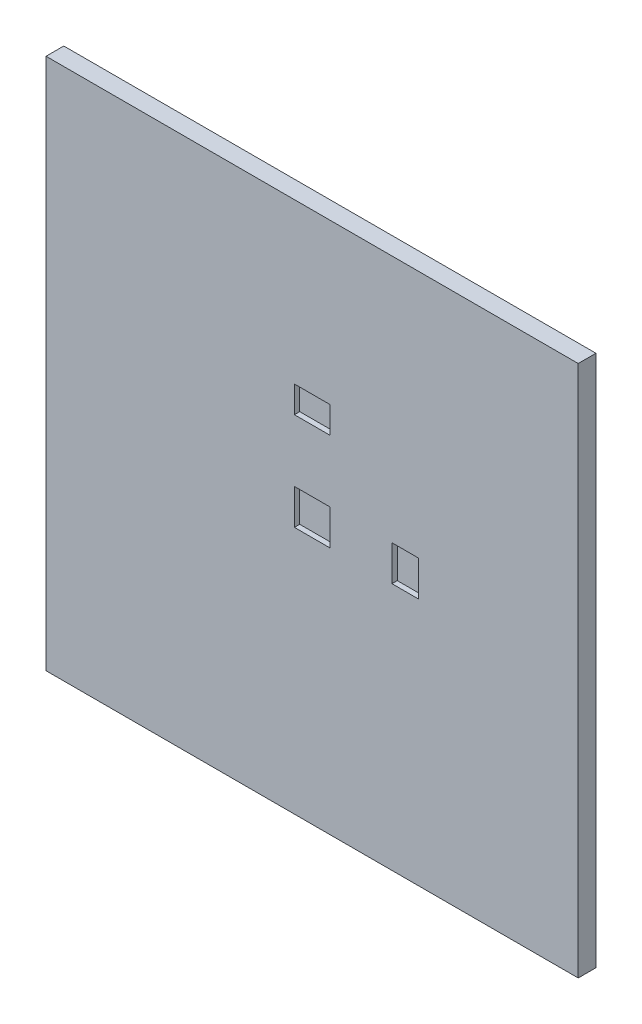
ISO-10303-21;
HEADER;
FILE_DESCRIPTION(('STEP AP214'),'2;1');
FILE_NAME('part.step','',(''),(''),'','','');
FILE_SCHEMA(('AUTOMOTIVE_DESIGN { 1 0 10303 214 1 1 1 1 }'));
ENDSEC;
DATA;
#1=APPLICATION_CONTEXT('core data for automotive mechanical design processes');
#2=APPLICATION_PROTOCOL_DEFINITION('international standard','automotive_design',2000,#1);
#3=PRODUCT_CONTEXT('',#1,'mechanical');
#4=PRODUCT('Part','Part','',(#3));
#5=PRODUCT_RELATED_PRODUCT_CATEGORY('part','',(#4));
#6=PRODUCT_DEFINITION_FORMATION('','',#4);
#7=PRODUCT_DEFINITION_CONTEXT('part definition',#1,'design');
#8=PRODUCT_DEFINITION('design','',#6,#7);
#9=PRODUCT_DEFINITION_SHAPE('','',#8);
#10=(LENGTH_UNIT() NAMED_UNIT(*) SI_UNIT(.MILLI.,.METRE.));
#11=(NAMED_UNIT(*) PLANE_ANGLE_UNIT() SI_UNIT($,.RADIAN.));
#12=(NAMED_UNIT(*) SI_UNIT($,.STERADIAN.) SOLID_ANGLE_UNIT());
#13=UNCERTAINTY_MEASURE_WITH_UNIT(LENGTH_MEASURE(1.E-05),#10,'distance_accuracy_value','');
#14=(GEOMETRIC_REPRESENTATION_CONTEXT(3) GLOBAL_UNCERTAINTY_ASSIGNED_CONTEXT((#13)) GLOBAL_UNIT_ASSIGNED_CONTEXT((#10,
#11,#12)) REPRESENTATION_CONTEXT('',''));
#15=CARTESIAN_POINT('',(0.,0.,0.));
#16=DIRECTION('',(0.,0.,1.));
#17=DIRECTION('',(1.,0.,0.));
#18=AXIS2_PLACEMENT_3D('',#15,#16,#17);
#19=CARTESIAN_POINT('',(-212.408759124088,147.810218978102,10.));
#20=DIRECTION('',(1.,0.,0.));
#21=DIRECTION('',(0.,0.,-1.));
#22=AXIS2_PLACEMENT_3D('',#19,#20,#21);
#23=PLANE('',#22);
#24=DIRECTION('',(0.,-1.,0.));
#25=VECTOR('',#24,1.);
#26=CARTESIAN_POINT('',(-212.408759124088,147.810218978102,0.));
#27=LINE('',#26,#25);
#28=CARTESIAN_POINT('',(-212.408759124088,147.810218978102,0.));
#29=VERTEX_POINT('',#28);
#30=CARTESIAN_POINT('',(-212.408759124088,-152.189781021898,0.));
#31=VERTEX_POINT('',#30);
#32=EDGE_CURVE('E223',#29,#31,#27,.T.);
#33=ORIENTED_EDGE('',*,*,#32,.T.);
#34=DIRECTION('',(0.,0.,-1.));
#35=VECTOR('',#34,1.);
#36=CARTESIAN_POINT('',(-212.408759124088,-152.189781021898,10.));
#37=LINE('',#36,#35);
#38=CARTESIAN_POINT('',(-212.408759124088,-152.189781021898,10.));
#39=VERTEX_POINT('',#38);
#40=EDGE_CURVE('E11',#39,#31,#37,.T.);
#41=ORIENTED_EDGE('',*,*,#40,.F.);
#42=DIRECTION('',(0.,-1.,0.));
#43=VECTOR('',#42,1.);
#44=CARTESIAN_POINT('',(-212.408759124088,147.810218978102,10.));
#45=LINE('',#44,#43);
#46=CARTESIAN_POINT('',(-212.408759124088,147.810218978102,10.));
#47=VERTEX_POINT('',#46);
#48=EDGE_CURVE('E230',#47,#39,#45,.T.);
#49=ORIENTED_EDGE('',*,*,#48,.F.);
#50=DIRECTION('',(0.,0.,-1.));
#51=VECTOR('',#50,1.);
#52=CARTESIAN_POINT('',(-212.408759124088,147.810218978102,10.));
#53=LINE('',#52,#51);
#54=EDGE_CURVE('E240',#47,#29,#53,.T.);
#55=ORIENTED_EDGE('',*,*,#54,.T.);
#56=EDGE_LOOP('',(#33,#41,#49,#55));
#57=FACE_BOUND('',#56,.T.);
#58=ADVANCED_FACE('F17',(#57),#23,.F.);
#59=CARTESIAN_POINT('',(-212.408759124088,-152.189781021898,10.));
#60=DIRECTION('',(0.,1.,0.));
#61=DIRECTION('',(-1.,0.,0.));
#62=AXIS2_PLACEMENT_3D('',#59,#60,#61);
#63=PLANE('',#62);
#64=DIRECTION('',(1.,0.,0.));
#65=VECTOR('',#64,1.);
#66=CARTESIAN_POINT('',(-212.408759124088,-152.189781021898,0.));
#67=LINE('',#66,#65);
#68=CARTESIAN_POINT('',(87.5912408759124,-152.189781021898,0.));
#69=VERTEX_POINT('',#68);
#70=EDGE_CURVE('E243',#31,#69,#67,.T.);
#71=ORIENTED_EDGE('',*,*,#70,.T.);
#72=DIRECTION('',(0.,0.,-1.));
#73=VECTOR('',#72,1.);
#74=CARTESIAN_POINT('',(87.5912408759124,-152.189781021898,10.));
#75=LINE('',#74,#73);
#76=CARTESIAN_POINT('',(87.5912408759124,-152.189781021898,10.));
#77=VERTEX_POINT('',#76);
#78=EDGE_CURVE('E24',#77,#69,#75,.T.);
#79=ORIENTED_EDGE('',*,*,#78,.F.);
#80=DIRECTION('',(1.,0.,0.));
#81=VECTOR('',#80,1.);
#82=CARTESIAN_POINT('',(-212.408759124088,-152.189781021898,10.));
#83=LINE('',#82,#81);
#84=EDGE_CURVE('E233',#39,#77,#83,.T.);
#85=ORIENTED_EDGE('',*,*,#84,.F.);
#86=ORIENTED_EDGE('',*,*,#40,.T.);
#87=EDGE_LOOP('',(#71,#79,#85,#86));
#88=FACE_BOUND('',#87,.T.);
#89=ADVANCED_FACE('F273',(#88),#63,.F.);
#90=CARTESIAN_POINT('',(87.5912408759124,147.810218978102,10.));
#91=DIRECTION('',(-1.,0.,0.));
#92=DIRECTION('',(0.,0.,1.));
#93=AXIS2_PLACEMENT_3D('',#90,#91,#92);
#94=PLANE('',#93);
#95=DIRECTION('',(0.,1.,0.));
#96=VECTOR('',#95,1.);
#97=CARTESIAN_POINT('',(87.5912408759124,147.810218978102,0.));
#98=LINE('',#97,#96);
#99=CARTESIAN_POINT('',(87.5912408759124,147.810218978102,0.));
#100=VERTEX_POINT('',#99);
#101=EDGE_CURVE('E245',#69,#100,#98,.T.);
#102=ORIENTED_EDGE('',*,*,#101,.T.);
#103=DIRECTION('',(0.,0.,-1.));
#104=VECTOR('',#103,1.);
#105=CARTESIAN_POINT('',(87.5912408759124,147.810218978102,10.));
#106=LINE('',#105,#104);
#107=CARTESIAN_POINT('',(87.5912408759124,147.810218978102,10.));
#108=VERTEX_POINT('',#107);
#109=EDGE_CURVE('E250',#108,#100,#106,.T.);
#110=ORIENTED_EDGE('',*,*,#109,.F.);
#111=DIRECTION('',(0.,1.,0.));
#112=VECTOR('',#111,1.);
#113=CARTESIAN_POINT('',(87.5912408759124,147.810218978102,10.));
#114=LINE('',#113,#112);
#115=EDGE_CURVE('E236',#77,#108,#114,.T.);
#116=ORIENTED_EDGE('',*,*,#115,.F.);
#117=ORIENTED_EDGE('',*,*,#78,.T.);
#118=EDGE_LOOP('',(#102,#110,#116,#117));
#119=FACE_BOUND('',#118,.T.);
#120=ADVANCED_FACE('F257',(#119),#94,.F.);
#121=CARTESIAN_POINT('',(-212.408759124088,147.810218978102,10.));
#122=DIRECTION('',(0.,-1.,0.));
#123=DIRECTION('',(0.,0.,-1.));
#124=AXIS2_PLACEMENT_3D('',#121,#122,#123);
#125=PLANE('',#124);
#126=DIRECTION('',(-1.,0.,0.));
#127=VECTOR('',#126,1.);
#128=CARTESIAN_POINT('',(-212.408759124088,147.810218978102,0.));
#129=LINE('',#128,#127);
#130=EDGE_CURVE('E234',#100,#29,#129,.T.);
#131=ORIENTED_EDGE('',*,*,#130,.T.);
#132=ORIENTED_EDGE('',*,*,#54,.F.);
#133=DIRECTION('',(-1.,0.,0.));
#134=VECTOR('',#133,1.);
#135=CARTESIAN_POINT('',(-212.408759124088,147.810218978102,10.));
#136=LINE('',#135,#134);
#137=EDGE_CURVE('E238',#108,#47,#136,.T.);
#138=ORIENTED_EDGE('',*,*,#137,.F.);
#139=ORIENTED_EDGE('',*,*,#109,.T.);
#140=EDGE_LOOP('',(#131,#132,#138,#139));
#141=FACE_BOUND('',#140,.T.);
#142=ADVANCED_FACE('F266',(#141),#125,.F.);
#143=CARTESIAN_POINT('',(0.,0.,10.));
#144=DIRECTION('',(0.,0.,1.));
#145=DIRECTION('',(1.,0.,0.));
#146=AXIS2_PLACEMENT_3D('',#143,#144,#145);
#147=PLANE('',#146);
#148=DIRECTION('',(0.,-1.,0.));
#149=VECTOR('',#148,1.);
#150=CARTESIAN_POINT('',(-72.4087591240876,57.8102189781022,10.));
#151=LINE('',#150,#149);
#152=CARTESIAN_POINT('',(-72.4087591240876,57.8102189781022,10.));
#153=VERTEX_POINT('',#152);
#154=CARTESIAN_POINT('',(-72.4087591240876,42.8102189781022,10.));
#155=VERTEX_POINT('',#154);
#156=EDGE_CURVE('E31',#153,#155,#151,.T.);
#157=ORIENTED_EDGE('',*,*,#156,.F.);
#158=DIRECTION('',(-1.,0.,0.));
#159=VECTOR('',#158,1.);
#160=CARTESIAN_POINT('',(-72.4087591240876,57.8102189781022,10.));
#161=LINE('',#160,#159);
#162=CARTESIAN_POINT('',(-52.4087591240876,57.8102189781022,10.));
#163=VERTEX_POINT('',#162);
#164=EDGE_CURVE('E149',#163,#153,#161,.T.);
#165=ORIENTED_EDGE('',*,*,#164,.F.);
#166=DIRECTION('',(0.,1.,0.));
#167=VECTOR('',#166,1.);
#168=CARTESIAN_POINT('',(-52.4087591240876,57.8102189781022,10.));
#169=LINE('',#168,#167);
#170=CARTESIAN_POINT('',(-52.4087591240876,42.8102189781022,10.));
#171=VERTEX_POINT('',#170);
#172=EDGE_CURVE('E152',#171,#163,#169,.T.);
#173=ORIENTED_EDGE('',*,*,#172,.F.);
#174=DIRECTION('',(1.,0.,0.));
#175=VECTOR('',#174,1.);
#176=CARTESIAN_POINT('',(-72.4087591240876,42.8102189781022,10.));
#177=LINE('',#176,#175);
#178=EDGE_CURVE('E158',#155,#171,#177,.T.);
#179=ORIENTED_EDGE('',*,*,#178,.F.);
#180=EDGE_LOOP('',(#157,#165,#173,#179));
#181=FACE_BOUND('',#180,.T.);
#182=DIRECTION('',(0.,-1.,0.));
#183=VECTOR('',#182,1.);
#184=CARTESIAN_POINT('',(-17.4087591240876,7.81021897810221,10.));
#185=LINE('',#184,#183);
#186=CARTESIAN_POINT('',(-17.4087591240876,7.81021897810221,10.));
#187=VERTEX_POINT('',#186);
#188=CARTESIAN_POINT('',(-17.4087591240876,-12.1897810218978,10.));
#189=VERTEX_POINT('',#188);
#190=EDGE_CURVE('E39',#187,#189,#185,.T.);
#191=ORIENTED_EDGE('',*,*,#190,.F.);
#192=DIRECTION('',(-1.,0.,0.));
#193=VECTOR('',#192,1.);
#194=CARTESIAN_POINT('',(-17.4087591240876,7.81021897810221,10.));
#195=LINE('',#194,#193);
#196=CARTESIAN_POINT('',(-2.40875912408758,7.81021897810221,10.));
#197=VERTEX_POINT('',#196);
#198=EDGE_CURVE('E173',#197,#187,#195,.T.);
#199=ORIENTED_EDGE('',*,*,#198,.F.);
#200=DIRECTION('',(0.,1.,0.));
#201=VECTOR('',#200,1.);
#202=CARTESIAN_POINT('',(-2.40875912408758,7.81021897810221,10.));
#203=LINE('',#202,#201);
#204=CARTESIAN_POINT('',(-2.40875912408758,-12.1897810218978,10.));
#205=VERTEX_POINT('',#204);
#206=EDGE_CURVE('E187',#205,#197,#203,.T.);
#207=ORIENTED_EDGE('',*,*,#206,.F.);
#208=DIRECTION('',(1.,0.,0.));
#209=VECTOR('',#208,1.);
#210=CARTESIAN_POINT('',(-17.4087591240876,-12.1897810218978,10.));
#211=LINE('',#210,#209);
#212=EDGE_CURVE('E184',#189,#205,#211,.T.);
#213=ORIENTED_EDGE('',*,*,#212,.F.);
#214=EDGE_LOOP('',(#191,#199,#207,#213));
#215=FACE_BOUND('',#214,.T.);
#216=DIRECTION('',(0.,-1.,0.));
#217=VECTOR('',#216,1.);
#218=CARTESIAN_POINT('',(-72.4087591240876,7.81021897810219,10.));
#219=LINE('',#218,#217);
#220=CARTESIAN_POINT('',(-72.4087591240876,7.81021897810219,10.));
#221=VERTEX_POINT('',#220);
#222=CARTESIAN_POINT('',(-72.4087591240876,-12.1897810218978,10.));
#223=VERTEX_POINT('',#222);
#224=EDGE_CURVE('E165',#221,#223,#219,.T.);
#225=ORIENTED_EDGE('',*,*,#224,.F.);
#226=DIRECTION('',(-1.,0.,0.));
#227=VECTOR('',#226,1.);
#228=CARTESIAN_POINT('',(-72.4087591240876,7.81021897810219,10.));
#229=LINE('',#228,#227);
#230=CARTESIAN_POINT('',(-52.4087591240876,7.81021897810217,10.));
#231=VERTEX_POINT('',#230);
#232=EDGE_CURVE('E202',#231,#221,#229,.T.);
#233=ORIENTED_EDGE('',*,*,#232,.F.);
#234=DIRECTION('',(0.,1.,0.));
#235=VECTOR('',#234,1.);
#236=CARTESIAN_POINT('',(-52.4087591240876,7.81021897810217,10.));
#237=LINE('',#236,#235);
#238=CARTESIAN_POINT('',(-52.4087591240876,-12.1897810218978,10.));
#239=VERTEX_POINT('',#238);
#240=EDGE_CURVE('E216',#239,#231,#237,.T.);
#241=ORIENTED_EDGE('',*,*,#240,.F.);
#242=DIRECTION('',(1.,0.,0.));
#243=VECTOR('',#242,1.);
#244=CARTESIAN_POINT('',(-72.4087591240876,-12.1897810218978,10.));
#245=LINE('',#244,#243);
#246=EDGE_CURVE('E213',#223,#239,#245,.T.);
#247=ORIENTED_EDGE('',*,*,#246,.F.);
#248=EDGE_LOOP('',(#225,#233,#241,#247));
#249=FACE_BOUND('',#248,.T.);
#250=ORIENTED_EDGE('',*,*,#48,.T.);
#251=ORIENTED_EDGE('',*,*,#84,.T.);
#252=ORIENTED_EDGE('',*,*,#115,.T.);
#253=ORIENTED_EDGE('',*,*,#137,.T.);
#254=EDGE_LOOP('',(#250,#251,#252,#253));
#255=FACE_BOUND('',#254,.T.);
#256=ADVANCED_FACE('F272',(#181,#215,#249,#255),#147,.T.);
#257=CARTESIAN_POINT('',(0.,0.,0.));
#258=DIRECTION('',(0.,0.,1.));
#259=DIRECTION('',(1.,0.,0.));
#260=AXIS2_PLACEMENT_3D('',#257,#258,#259);
#261=PLANE('',#260);
#262=ORIENTED_EDGE('',*,*,#32,.F.);
#263=ORIENTED_EDGE('',*,*,#130,.F.);
#264=ORIENTED_EDGE('',*,*,#101,.F.);
#265=ORIENTED_EDGE('',*,*,#70,.F.);
#266=EDGE_LOOP('',(#262,#263,#264,#265));
#267=FACE_BOUND('',#266,.T.);
#268=ADVANCED_FACE('F263',(#267),#261,.F.);
#269=CARTESIAN_POINT('',(-72.4087591240876,7.81021897810219,7.));
#270=DIRECTION('',(-1.,0.,0.));
#271=DIRECTION('',(0.,0.,1.));
#272=AXIS2_PLACEMENT_3D('',#269,#270,#271);
#273=PLANE('',#272);
#274=ORIENTED_EDGE('',*,*,#224,.T.);
#275=DIRECTION('',(0.,0.,1.));
#276=VECTOR('',#275,1.);
#277=CARTESIAN_POINT('',(-72.4087591240876,-12.1897810218978,7.));
#278=LINE('',#277,#276);
#279=CARTESIAN_POINT('',(-72.4087591240876,-12.1897810218978,7.));
#280=VERTEX_POINT('',#279);
#281=EDGE_CURVE('E211',#280,#223,#278,.T.);
#282=ORIENTED_EDGE('',*,*,#281,.F.);
#283=DIRECTION('',(0.,-1.,0.));
#284=VECTOR('',#283,1.);
#285=CARTESIAN_POINT('',(-72.4087591240876,7.81021897810219,7.));
#286=LINE('',#285,#284);
#287=CARTESIAN_POINT('',(-72.4087591240876,7.81021897810219,7.));
#288=VERTEX_POINT('',#287);
#289=EDGE_CURVE('E198',#288,#280,#286,.T.);
#290=ORIENTED_EDGE('',*,*,#289,.F.);
#291=DIRECTION('',(0.,0.,1.));
#292=VECTOR('',#291,1.);
#293=CARTESIAN_POINT('',(-72.4087591240876,7.81021897810219,7.));
#294=LINE('',#293,#292);
#295=EDGE_CURVE('E221',#288,#221,#294,.T.);
#296=ORIENTED_EDGE('',*,*,#295,.T.);
#297=EDGE_LOOP('',(#274,#282,#290,#296));
#298=FACE_BOUND('',#297,.T.);
#299=ADVANCED_FACE('F287',(#298),#273,.F.);
#300=CARTESIAN_POINT('',(-72.4087591240876,7.81021897810219,7.));
#301=DIRECTION('',(0.,1.,0.));
#302=DIRECTION('',(-1.,0.,0.));
#303=AXIS2_PLACEMENT_3D('',#300,#301,#302);
#304=PLANE('',#303);
#305=ORIENTED_EDGE('',*,*,#232,.T.);
#306=ORIENTED_EDGE('',*,*,#295,.F.);
#307=DIRECTION('',(-1.,0.,0.));
#308=VECTOR('',#307,1.);
#309=CARTESIAN_POINT('',(-72.4087591240876,7.81021897810219,7.));
#310=LINE('',#309,#308);
#311=CARTESIAN_POINT('',(-52.4087591240876,7.81021897810217,7.));
#312=VERTEX_POINT('',#311);
#313=EDGE_CURVE('E208',#312,#288,#310,.T.);
#314=ORIENTED_EDGE('',*,*,#313,.F.);
#315=DIRECTION('',(0.,0.,1.));
#316=VECTOR('',#315,1.);
#317=CARTESIAN_POINT('',(-52.4087591240876,7.81021897810217,7.));
#318=LINE('',#317,#316);
#319=EDGE_CURVE('E224',#312,#231,#318,.T.);
#320=ORIENTED_EDGE('',*,*,#319,.T.);
#321=EDGE_LOOP('',(#305,#306,#314,#320));
#322=FACE_BOUND('',#321,.T.);
#323=ADVANCED_FACE('F293',(#322),#304,.F.);
#324=CARTESIAN_POINT('',(-52.4087591240876,7.81021897810217,7.));
#325=DIRECTION('',(1.,0.,0.));
#326=DIRECTION('',(0.,1.,0.));
#327=AXIS2_PLACEMENT_3D('',#324,#325,#326);
#328=PLANE('',#327);
#329=ORIENTED_EDGE('',*,*,#240,.T.);
#330=ORIENTED_EDGE('',*,*,#319,.F.);
#331=DIRECTION('',(0.,1.,0.));
#332=VECTOR('',#331,1.);
#333=CARTESIAN_POINT('',(-52.4087591240876,7.81021897810217,7.));
#334=LINE('',#333,#332);
#335=CARTESIAN_POINT('',(-52.4087591240876,-12.1897810218978,7.));
#336=VERTEX_POINT('',#335);
#337=EDGE_CURVE('E205',#336,#312,#334,.T.);
#338=ORIENTED_EDGE('',*,*,#337,.F.);
#339=DIRECTION('',(0.,0.,1.));
#340=VECTOR('',#339,1.);
#341=CARTESIAN_POINT('',(-52.4087591240876,-12.1897810218978,7.));
#342=LINE('',#341,#340);
#343=EDGE_CURVE('E226',#336,#239,#342,.T.);
#344=ORIENTED_EDGE('',*,*,#343,.T.);
#345=EDGE_LOOP('',(#329,#330,#338,#344));
#346=FACE_BOUND('',#345,.T.);
#347=ADVANCED_FACE('F299',(#346),#328,.F.);
#348=CARTESIAN_POINT('',(-72.4087591240876,-12.1897810218978,7.));
#349=DIRECTION('',(0.,-1.,0.));
#350=DIRECTION('',(1.,0.,0.));
#351=AXIS2_PLACEMENT_3D('',#348,#349,#350);
#352=PLANE('',#351);
#353=ORIENTED_EDGE('',*,*,#246,.T.);
#354=ORIENTED_EDGE('',*,*,#343,.F.);
#355=DIRECTION('',(1.,0.,0.));
#356=VECTOR('',#355,1.);
#357=CARTESIAN_POINT('',(-72.4087591240876,-12.1897810218978,7.));
#358=LINE('',#357,#356);
#359=EDGE_CURVE('E201',#280,#336,#358,.T.);
#360=ORIENTED_EDGE('',*,*,#359,.F.);
#361=ORIENTED_EDGE('',*,*,#281,.T.);
#362=EDGE_LOOP('',(#353,#354,#360,#361));
#363=FACE_BOUND('',#362,.T.);
#364=ADVANCED_FACE('F295',(#363),#352,.F.);
#365=CARTESIAN_POINT('',(0.,0.,7.));
#366=DIRECTION('',(0.,0.,1.));
#367=DIRECTION('',(1.,0.,0.));
#368=AXIS2_PLACEMENT_3D('',#365,#366,#367);
#369=PLANE('',#368);
#370=ORIENTED_EDGE('',*,*,#289,.T.);
#371=ORIENTED_EDGE('',*,*,#359,.T.);
#372=ORIENTED_EDGE('',*,*,#337,.T.);
#373=ORIENTED_EDGE('',*,*,#313,.T.);
#374=EDGE_LOOP('',(#370,#371,#372,#373));
#375=FACE_BOUND('',#374,.T.);
#376=ADVANCED_FACE('F298',(#375),#369,.T.);
#377=CARTESIAN_POINT('',(-17.4087591240876,7.81021897810221,7.));
#378=DIRECTION('',(-1.,0.,0.));
#379=DIRECTION('',(0.,-1.,0.));
#380=AXIS2_PLACEMENT_3D('',#377,#378,#379);
#381=PLANE('',#380);
#382=ORIENTED_EDGE('',*,*,#190,.T.);
#383=DIRECTION('',(0.,0.,1.));
#384=VECTOR('',#383,1.);
#385=CARTESIAN_POINT('',(-17.4087591240876,-12.1897810218978,7.));
#386=LINE('',#385,#384);
#387=CARTESIAN_POINT('',(-17.4087591240876,-12.1897810218978,7.));
#388=VERTEX_POINT('',#387);
#389=EDGE_CURVE('E182',#388,#189,#386,.T.);
#390=ORIENTED_EDGE('',*,*,#389,.F.);
#391=DIRECTION('',(0.,-1.,0.));
#392=VECTOR('',#391,1.);
#393=CARTESIAN_POINT('',(-17.4087591240876,7.81021897810221,7.));
#394=LINE('',#393,#392);
#395=CARTESIAN_POINT('',(-17.4087591240876,7.81021897810221,7.));
#396=VERTEX_POINT('',#395);
#397=EDGE_CURVE('E169',#396,#388,#394,.T.);
#398=ORIENTED_EDGE('',*,*,#397,.F.);
#399=DIRECTION('',(0.,0.,1.));
#400=VECTOR('',#399,1.);
#401=CARTESIAN_POINT('',(-17.4087591240876,7.81021897810221,7.));
#402=LINE('',#401,#400);
#403=EDGE_CURVE('E159',#396,#187,#402,.T.);
#404=ORIENTED_EDGE('',*,*,#403,.T.);
#405=EDGE_LOOP('',(#382,#390,#398,#404));
#406=FACE_BOUND('',#405,.T.);
#407=ADVANCED_FACE('F309',(#406),#381,.F.);
#408=CARTESIAN_POINT('',(-17.4087591240876,7.81021897810221,7.));
#409=DIRECTION('',(0.,1.,0.));
#410=DIRECTION('',(0.,0.,1.));
#411=AXIS2_PLACEMENT_3D('',#408,#409,#410);
#412=PLANE('',#411);
#413=ORIENTED_EDGE('',*,*,#198,.T.);
#414=ORIENTED_EDGE('',*,*,#403,.F.);
#415=DIRECTION('',(-1.,0.,0.));
#416=VECTOR('',#415,1.);
#417=CARTESIAN_POINT('',(-17.4087591240876,7.81021897810221,7.));
#418=LINE('',#417,#416);
#419=CARTESIAN_POINT('',(-2.40875912408758,7.81021897810221,7.));
#420=VERTEX_POINT('',#419);
#421=EDGE_CURVE('E179',#420,#396,#418,.T.);
#422=ORIENTED_EDGE('',*,*,#421,.F.);
#423=DIRECTION('',(0.,0.,1.));
#424=VECTOR('',#423,1.);
#425=CARTESIAN_POINT('',(-2.40875912408758,7.81021897810221,7.));
#426=LINE('',#425,#424);
#427=EDGE_CURVE('E193',#420,#197,#426,.T.);
#428=ORIENTED_EDGE('',*,*,#427,.T.);
#429=EDGE_LOOP('',(#413,#414,#422,#428));
#430=FACE_BOUND('',#429,.T.);
#431=ADVANCED_FACE('F313',(#430),#412,.F.);
#432=CARTESIAN_POINT('',(-2.40875912408758,7.81021897810221,7.));
#433=DIRECTION('',(1.,0.,0.));
#434=DIRECTION('',(0.,1.,0.));
#435=AXIS2_PLACEMENT_3D('',#432,#433,#434);
#436=PLANE('',#435);
#437=ORIENTED_EDGE('',*,*,#206,.T.);
#438=ORIENTED_EDGE('',*,*,#427,.F.);
#439=DIRECTION('',(0.,1.,0.));
#440=VECTOR('',#439,1.);
#441=CARTESIAN_POINT('',(-2.40875912408758,7.81021897810221,7.));
#442=LINE('',#441,#440);
#443=CARTESIAN_POINT('',(-2.40875912408758,-12.1897810218978,7.));
#444=VERTEX_POINT('',#443);
#445=EDGE_CURVE('E176',#444,#420,#442,.T.);
#446=ORIENTED_EDGE('',*,*,#445,.F.);
#447=DIRECTION('',(0.,0.,1.));
#448=VECTOR('',#447,1.);
#449=CARTESIAN_POINT('',(-2.40875912408758,-12.1897810218978,7.));
#450=LINE('',#449,#448);
#451=EDGE_CURVE('E195',#444,#205,#450,.T.);
#452=ORIENTED_EDGE('',*,*,#451,.T.);
#453=EDGE_LOOP('',(#437,#438,#446,#452));
#454=FACE_BOUND('',#453,.T.);
#455=ADVANCED_FACE('F318',(#454),#436,.F.);
#456=CARTESIAN_POINT('',(-17.4087591240876,-12.1897810218978,7.));
#457=DIRECTION('',(0.,-1.,0.));
#458=DIRECTION('',(1.,0.,0.));
#459=AXIS2_PLACEMENT_3D('',#456,#457,#458);
#460=PLANE('',#459);
#461=ORIENTED_EDGE('',*,*,#212,.T.);
#462=ORIENTED_EDGE('',*,*,#451,.F.);
#463=DIRECTION('',(1.,0.,0.));
#464=VECTOR('',#463,1.);
#465=CARTESIAN_POINT('',(-17.4087591240876,-12.1897810218978,7.));
#466=LINE('',#465,#464);
#467=EDGE_CURVE('E172',#388,#444,#466,.T.);
#468=ORIENTED_EDGE('',*,*,#467,.F.);
#469=ORIENTED_EDGE('',*,*,#389,.T.);
#470=EDGE_LOOP('',(#461,#462,#468,#469));
#471=FACE_BOUND('',#470,.T.);
#472=ADVANCED_FACE('F314',(#471),#460,.F.);
#473=CARTESIAN_POINT('',(0.,0.,7.));
#474=DIRECTION('',(0.,0.,1.));
#475=DIRECTION('',(1.,0.,0.));
#476=AXIS2_PLACEMENT_3D('',#473,#474,#475);
#477=PLANE('',#476);
#478=ORIENTED_EDGE('',*,*,#397,.T.);
#479=ORIENTED_EDGE('',*,*,#467,.T.);
#480=ORIENTED_EDGE('',*,*,#445,.T.);
#481=ORIENTED_EDGE('',*,*,#421,.T.);
#482=EDGE_LOOP('',(#478,#479,#480,#481));
#483=FACE_BOUND('',#482,.T.);
#484=ADVANCED_FACE('F317',(#483),#477,.T.);
#485=CARTESIAN_POINT('',(-72.4087591240876,57.8102189781022,7.));
#486=DIRECTION('',(-1.,0.,0.));
#487=DIRECTION('',(0.,-1.,0.));
#488=AXIS2_PLACEMENT_3D('',#485,#486,#487);
#489=PLANE('',#488);
#490=ORIENTED_EDGE('',*,*,#156,.T.);
#491=DIRECTION('',(0.,0.,1.));
#492=VECTOR('',#491,1.);
#493=CARTESIAN_POINT('',(-72.4087591240876,42.8102189781022,7.));
#494=LINE('',#493,#492);
#495=CARTESIAN_POINT('',(-72.4087591240876,42.8102189781022,7.));
#496=VERTEX_POINT('',#495);
#497=EDGE_CURVE('E127',#496,#155,#494,.T.);
#498=ORIENTED_EDGE('',*,*,#497,.F.);
#499=DIRECTION('',(0.,-1.,0.));
#500=VECTOR('',#499,1.);
#501=CARTESIAN_POINT('',(-72.4087591240876,57.8102189781022,7.));
#502=LINE('',#501,#500);
#503=CARTESIAN_POINT('',(-72.4087591240876,57.8102189781022,7.));
#504=VERTEX_POINT('',#503);
#505=EDGE_CURVE('E131',#504,#496,#502,.T.);
#506=ORIENTED_EDGE('',*,*,#505,.F.);
#507=DIRECTION('',(0.,0.,1.));
#508=VECTOR('',#507,1.);
#509=CARTESIAN_POINT('',(-72.4087591240876,57.8102189781022,7.));
#510=LINE('',#509,#508);
#511=EDGE_CURVE('E163',#504,#153,#510,.T.);
#512=ORIENTED_EDGE('',*,*,#511,.T.);
#513=EDGE_LOOP('',(#490,#498,#506,#512));
#514=FACE_BOUND('',#513,.T.);
#515=ADVANCED_FACE('F129',(#514),#489,.F.);
#516=CARTESIAN_POINT('',(-72.4087591240876,57.8102189781022,7.));
#517=DIRECTION('',(0.,1.,0.));
#518=DIRECTION('',(-1.,0.,0.));
#519=AXIS2_PLACEMENT_3D('',#516,#517,#518);
#520=PLANE('',#519);
#521=ORIENTED_EDGE('',*,*,#164,.T.);
#522=ORIENTED_EDGE('',*,*,#511,.F.);
#523=DIRECTION('',(-1.,0.,0.));
#524=VECTOR('',#523,1.);
#525=CARTESIAN_POINT('',(-72.4087591240876,57.8102189781022,7.));
#526=LINE('',#525,#524);
#527=CARTESIAN_POINT('',(-52.4087591240876,57.8102189781022,7.));
#528=VERTEX_POINT('',#527);
#529=EDGE_CURVE('E137',#528,#504,#526,.T.);
#530=ORIENTED_EDGE('',*,*,#529,.F.);
#531=DIRECTION('',(0.,0.,1.));
#532=VECTOR('',#531,1.);
#533=CARTESIAN_POINT('',(-52.4087591240876,57.8102189781022,7.));
#534=LINE('',#533,#532);
#535=EDGE_CURVE('E166',#528,#163,#534,.T.);
#536=ORIENTED_EDGE('',*,*,#535,.T.);
#537=EDGE_LOOP('',(#521,#522,#530,#536));
#538=FACE_BOUND('',#537,.T.);
#539=ADVANCED_FACE('F331',(#538),#520,.F.);
#540=CARTESIAN_POINT('',(-52.4087591240876,57.8102189781022,7.));
#541=DIRECTION('',(1.,0.,0.));
#542=DIRECTION('',(0.,1.,0.));
#543=AXIS2_PLACEMENT_3D('',#540,#541,#542);
#544=PLANE('',#543);
#545=ORIENTED_EDGE('',*,*,#172,.T.);
#546=ORIENTED_EDGE('',*,*,#535,.F.);
#547=DIRECTION('',(0.,1.,0.));
#548=VECTOR('',#547,1.);
#549=CARTESIAN_POINT('',(-52.4087591240876,57.8102189781022,7.));
#550=LINE('',#549,#548);
#551=CARTESIAN_POINT('',(-52.4087591240876,42.8102189781022,7.));
#552=VERTEX_POINT('',#551);
#553=EDGE_CURVE('E145',#552,#528,#550,.T.);
#554=ORIENTED_EDGE('',*,*,#553,.F.);
#555=DIRECTION('',(0.,0.,1.));
#556=VECTOR('',#555,1.);
#557=CARTESIAN_POINT('',(-52.4087591240876,42.8102189781022,7.));
#558=LINE('',#557,#556);
#559=EDGE_CURVE('E136',#552,#171,#558,.T.);
#560=ORIENTED_EDGE('',*,*,#559,.T.);
#561=EDGE_LOOP('',(#545,#546,#554,#560));
#562=FACE_BOUND('',#561,.T.);
#563=ADVANCED_FACE('F334',(#562),#544,.F.);
#564=CARTESIAN_POINT('',(-72.4087591240876,42.8102189781022,7.));
#565=DIRECTION('',(0.,-1.,0.));
#566=DIRECTION('',(0.,0.,-1.));
#567=AXIS2_PLACEMENT_3D('',#564,#565,#566);
#568=PLANE('',#567);
#569=ORIENTED_EDGE('',*,*,#178,.T.);
#570=ORIENTED_EDGE('',*,*,#559,.F.);
#571=DIRECTION('',(1.,0.,0.));
#572=VECTOR('',#571,1.);
#573=CARTESIAN_POINT('',(-72.4087591240876,42.8102189781022,7.));
#574=LINE('',#573,#572);
#575=EDGE_CURVE('E140',#496,#552,#574,.T.);
#576=ORIENTED_EDGE('',*,*,#575,.F.);
#577=ORIENTED_EDGE('',*,*,#497,.T.);
#578=EDGE_LOOP('',(#569,#570,#576,#577));
#579=FACE_BOUND('',#578,.T.);
#580=ADVANCED_FACE('F141',(#579),#568,.F.);
#581=CARTESIAN_POINT('',(0.,0.,7.));
#582=DIRECTION('',(0.,0.,1.));
#583=DIRECTION('',(1.,0.,0.));
#584=AXIS2_PLACEMENT_3D('',#581,#582,#583);
#585=PLANE('',#584);
#586=ORIENTED_EDGE('',*,*,#505,.T.);
#587=ORIENTED_EDGE('',*,*,#575,.T.);
#588=ORIENTED_EDGE('',*,*,#553,.T.);
#589=ORIENTED_EDGE('',*,*,#529,.T.);
#590=EDGE_LOOP('',(#586,#587,#588,#589));
#591=FACE_BOUND('',#590,.T.);
#592=ADVANCED_FACE('F147',(#591),#585,.T.);
#593=CLOSED_SHELL('',(#58,#89,#120,#142,#256,#268,#299,#323,#347,#364,#376,#407,#431,#455,#472,
#484,#515,#539,#563,#580,#592));
#594=MANIFOLD_SOLID_BREP('B1',#593);
#595=ADVANCED_BREP_SHAPE_REPRESENTATION('',(#18,#594),#14);
#596=SHAPE_DEFINITION_REPRESENTATION(#9,#595);
ENDSEC;
END-ISO-10303-21;
